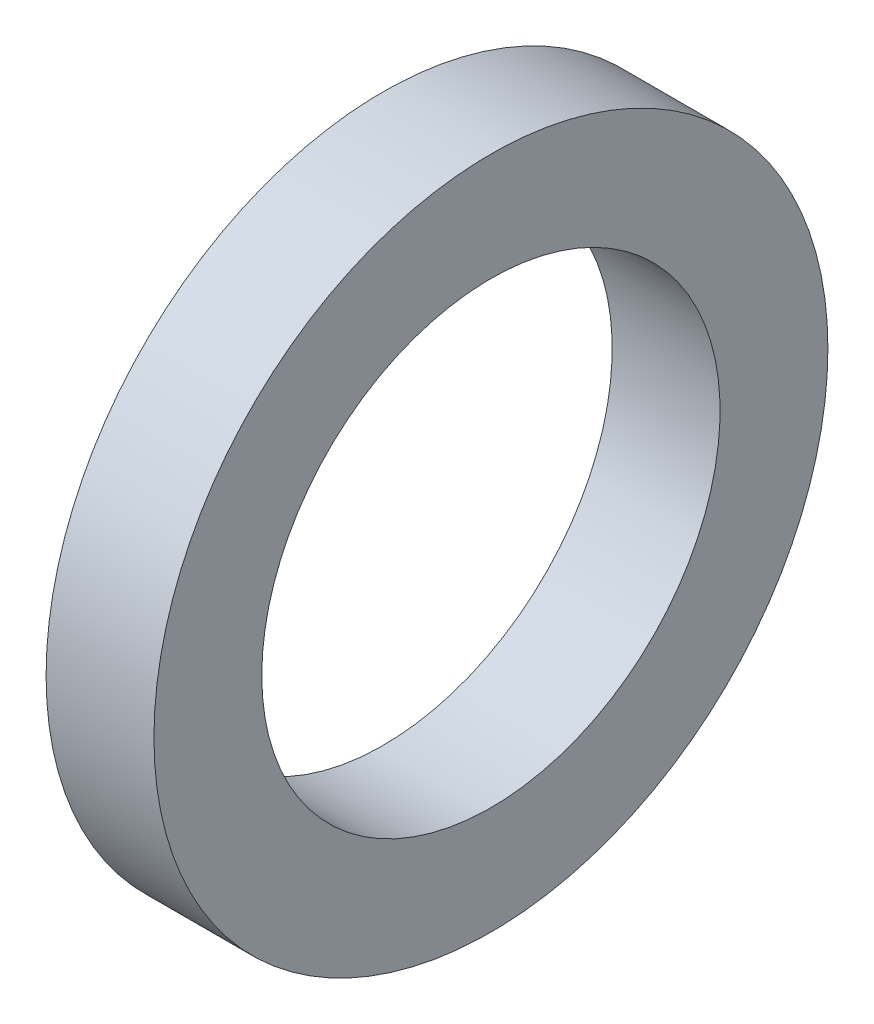
ISO-10303-21;
HEADER;
FILE_DESCRIPTION(('STEP AP214'),'2;1');
FILE_NAME('part.step','',(''),(''),'','','');
FILE_SCHEMA(('AUTOMOTIVE_DESIGN { 1 0 10303 214 1 1 1 1 }'));
ENDSEC;
DATA;
#1=APPLICATION_CONTEXT('core data for automotive mechanical design processes');
#2=APPLICATION_PROTOCOL_DEFINITION('international standard','automotive_design',2000,#1);
#3=PRODUCT_CONTEXT('',#1,'mechanical');
#4=PRODUCT('Part','Part','',(#3));
#5=PRODUCT_RELATED_PRODUCT_CATEGORY('part','',(#4));
#6=PRODUCT_DEFINITION_FORMATION('','',#4);
#7=PRODUCT_DEFINITION_CONTEXT('part definition',#1,'design');
#8=PRODUCT_DEFINITION('design','',#6,#7);
#9=PRODUCT_DEFINITION_SHAPE('','',#8);
#10=(LENGTH_UNIT() NAMED_UNIT(*) SI_UNIT(.MILLI.,.METRE.));
#11=(NAMED_UNIT(*) PLANE_ANGLE_UNIT() SI_UNIT($,.RADIAN.));
#12=(NAMED_UNIT(*) SI_UNIT($,.STERADIAN.) SOLID_ANGLE_UNIT());
#13=UNCERTAINTY_MEASURE_WITH_UNIT(LENGTH_MEASURE(1.E-05),#10,'distance_accuracy_value','');
#14=(GEOMETRIC_REPRESENTATION_CONTEXT(3) GLOBAL_UNCERTAINTY_ASSIGNED_CONTEXT((#13)) GLOBAL_UNIT_ASSIGNED_CONTEXT((#10,
#11,#12)) REPRESENTATION_CONTEXT('',''));
#15=CARTESIAN_POINT('',(0.,0.,0.));
#16=DIRECTION('',(0.,0.,1.));
#17=DIRECTION('',(1.,0.,0.));
#18=AXIS2_PLACEMENT_3D('',#15,#16,#17);
#19=CARTESIAN_POINT('',(-0.5,2.125,0.));
#20=DIRECTION('',(1.,0.,0.));
#21=DIRECTION('',(0.,0.,-1.));
#22=AXIS2_PLACEMENT_3D('',#19,#20,#21);
#23=PLANE('',#22);
#24=CARTESIAN_POINT('',(-0.5,0.,0.));
#25=DIRECTION('',(-1.,0.,0.));
#26=DIRECTION('',(0.,0.,1.));
#27=AXIS2_PLACEMENT_3D('',#24,#25,#26);
#28=CIRCLE('',#27,2.125);
#29=CARTESIAN_POINT('',(-0.5,0.,2.125));
#30=VERTEX_POINT('',#29);
#31=EDGE_CURVE('E10',#30,#30,#28,.T.);
#32=ORIENTED_EDGE('',*,*,#31,.F.);
#33=EDGE_LOOP('',(#32));
#34=FACE_BOUND('',#33,.T.);
#35=CARTESIAN_POINT('',(-0.5,0.,0.));
#36=DIRECTION('',(-1.,0.,0.));
#37=DIRECTION('',(0.,0.,1.));
#38=AXIS2_PLACEMENT_3D('',#35,#36,#37);
#39=CIRCLE('',#38,3.125);
#40=CARTESIAN_POINT('',(-0.5,0.,3.125));
#41=VERTEX_POINT('',#40);
#42=EDGE_CURVE('E49',#41,#41,#39,.T.);
#43=ORIENTED_EDGE('',*,*,#42,.T.);
#44=EDGE_LOOP('',(#43));
#45=FACE_BOUND('',#44,.T.);
#46=ADVANCED_FACE('F35',(#34,#45),#23,.F.);
#47=CARTESIAN_POINT('',(-3.88714285714286,0.,0.));
#48=DIRECTION('',(-1.,0.,0.));
#49=DIRECTION('',(0.,0.,1.));
#50=AXIS2_PLACEMENT_3D('',#47,#48,#49);
#51=CYLINDRICAL_SURFACE('',#50,2.125);
#52=CARTESIAN_POINT('',(0.5,0.,0.));
#53=DIRECTION('',(-1.,0.,0.));
#54=DIRECTION('',(0.,0.,1.));
#55=AXIS2_PLACEMENT_3D('',#52,#53,#54);
#56=CIRCLE('',#55,2.125);
#57=CARTESIAN_POINT('',(0.5,0.,2.125));
#58=VERTEX_POINT('',#57);
#59=EDGE_CURVE('E41',#58,#58,#56,.T.);
#60=ORIENTED_EDGE('',*,*,#59,.F.);
#61=EDGE_LOOP('',(#60));
#62=FACE_BOUND('',#61,.T.);
#63=ORIENTED_EDGE('',*,*,#31,.T.);
#64=EDGE_LOOP('',(#63));
#65=FACE_BOUND('',#64,.T.);
#66=ADVANCED_FACE('F64',(#62,#65),#51,.F.);
#67=CARTESIAN_POINT('',(0.5,2.125,0.));
#68=DIRECTION('',(-1.,0.,0.));
#69=DIRECTION('',(0.,0.,1.));
#70=AXIS2_PLACEMENT_3D('',#67,#68,#69);
#71=PLANE('',#70);
#72=CARTESIAN_POINT('',(0.5,0.,0.));
#73=DIRECTION('',(-1.,0.,0.));
#74=DIRECTION('',(0.,0.,1.));
#75=AXIS2_PLACEMENT_3D('',#72,#73,#74);
#76=CIRCLE('',#75,3.125);
#77=CARTESIAN_POINT('',(0.5,0.,3.125));
#78=VERTEX_POINT('',#77);
#79=EDGE_CURVE('E45',#78,#78,#76,.T.);
#80=ORIENTED_EDGE('',*,*,#79,.F.);
#81=EDGE_LOOP('',(#80));
#82=FACE_BOUND('',#81,.T.);
#83=ORIENTED_EDGE('',*,*,#59,.T.);
#84=EDGE_LOOP('',(#83));
#85=FACE_BOUND('',#84,.T.);
#86=ADVANCED_FACE('F59',(#82,#85),#71,.F.);
#87=CARTESIAN_POINT('',(-3.88714285714286,0.,0.));
#88=DIRECTION('',(-1.,0.,0.));
#89=DIRECTION('',(0.,0.,1.));
#90=AXIS2_PLACEMENT_3D('',#87,#88,#89);
#91=CYLINDRICAL_SURFACE('',#90,3.125);
#92=ORIENTED_EDGE('',*,*,#42,.F.);
#93=EDGE_LOOP('',(#92));
#94=FACE_BOUND('',#93,.T.);
#95=ORIENTED_EDGE('',*,*,#79,.T.);
#96=EDGE_LOOP('',(#95));
#97=FACE_BOUND('',#96,.T.);
#98=ADVANCED_FACE('F56',(#94,#97),#91,.T.);
#99=CLOSED_SHELL('',(#46,#66,#86,#98));
#100=MANIFOLD_SOLID_BREP('B2',#99);
#101=ADVANCED_BREP_SHAPE_REPRESENTATION('',(#18,#100),#14);
#102=SHAPE_DEFINITION_REPRESENTATION(#9,#101);
ENDSEC;
END-ISO-10303-21;
